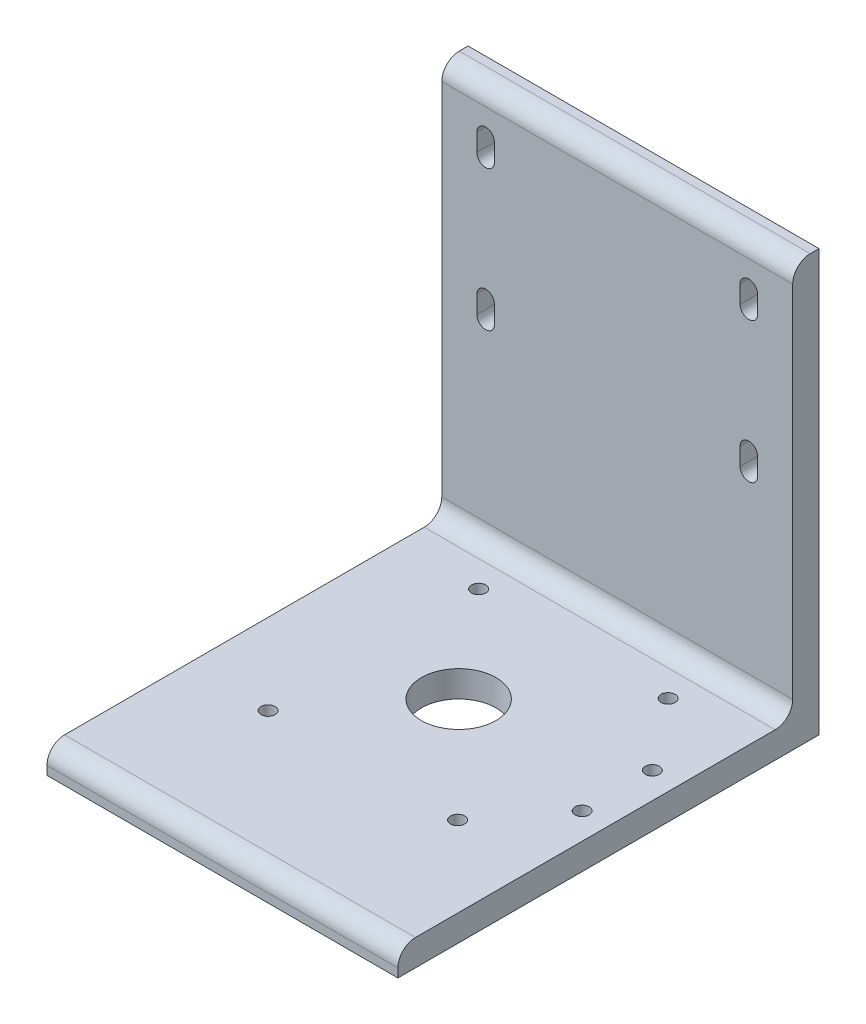
ISO-10303-21;
HEADER;
FILE_DESCRIPTION(('STEP AP214'),'2;1');
FILE_NAME('part.step','',(''),(''),'','','');
FILE_SCHEMA(('AUTOMOTIVE_DESIGN { 1 0 10303 214 1 1 1 1 }'));
ENDSEC;
DATA;
#1=APPLICATION_CONTEXT('core data for automotive mechanical design processes');
#2=APPLICATION_PROTOCOL_DEFINITION('international standard','automotive_design',2000,#1);
#3=PRODUCT_CONTEXT('',#1,'mechanical');
#4=PRODUCT('Part','Part','',(#3));
#5=PRODUCT_RELATED_PRODUCT_CATEGORY('part','',(#4));
#6=PRODUCT_DEFINITION_FORMATION('','',#4);
#7=PRODUCT_DEFINITION_CONTEXT('part definition',#1,'design');
#8=PRODUCT_DEFINITION('design','',#6,#7);
#9=PRODUCT_DEFINITION_SHAPE('','',#8);
#10=(LENGTH_UNIT() NAMED_UNIT(*) SI_UNIT(.MILLI.,.METRE.));
#11=(NAMED_UNIT(*) PLANE_ANGLE_UNIT() SI_UNIT($,.RADIAN.));
#12=(NAMED_UNIT(*) SI_UNIT($,.STERADIAN.) SOLID_ANGLE_UNIT());
#13=UNCERTAINTY_MEASURE_WITH_UNIT(LENGTH_MEASURE(1.E-05),#10,'distance_accuracy_value','');
#14=(GEOMETRIC_REPRESENTATION_CONTEXT(3) GLOBAL_UNCERTAINTY_ASSIGNED_CONTEXT((#13)) GLOBAL_UNIT_ASSIGNED_CONTEXT((#10,
#11,#12)) REPRESENTATION_CONTEXT('',''));
#15=CARTESIAN_POINT('',(0.,0.,0.));
#16=DIRECTION('',(0.,0.,1.));
#17=DIRECTION('',(1.,0.,0.));
#18=AXIS2_PLACEMENT_3D('',#15,#16,#17);
#19=CARTESIAN_POINT('',(63.5,0.,152.4));
#20=DIRECTION('',(0.,1.,0.));
#21=DIRECTION('',(0.,0.,1.));
#22=AXIS2_PLACEMENT_3D('',#19,#20,#21);
#23=PLANE('',#22);
#24=CARTESIAN_POINT('',(53.975,0.,50.8));
#25=DIRECTION('',(0.,-1.,0.));
#26=DIRECTION('',(0.,0.,-1.));
#27=AXIS2_PLACEMENT_3D('',#24,#25,#26);
#28=CIRCLE('',#27,2.55269999999999);
#29=CARTESIAN_POINT('',(53.975,0.,48.2473));
#30=VERTEX_POINT('',#29);
#31=EDGE_CURVE('E328',#30,#30,#28,.T.);
#32=ORIENTED_EDGE('',*,*,#31,.F.);
#33=EDGE_LOOP('',(#32));
#34=FACE_BOUND('',#33,.T.);
#35=CARTESIAN_POINT('',(53.975,0.,76.2));
#36=DIRECTION('',(0.,-1.,0.));
#37=DIRECTION('',(0.,0.,-1.));
#38=AXIS2_PLACEMENT_3D('',#35,#36,#37);
#39=CIRCLE('',#38,2.55269999999999);
#40=CARTESIAN_POINT('',(53.975,0.,73.6473));
#41=VERTEX_POINT('',#40);
#42=EDGE_CURVE('E332',#41,#41,#39,.T.);
#43=ORIENTED_EDGE('',*,*,#42,.F.);
#44=EDGE_LOOP('',(#43));
#45=FACE_BOUND('',#44,.T.);
#46=CARTESIAN_POINT('',(-3.4036,0.,63.5));
#47=DIRECTION('',(0.,1.,0.));
#48=DIRECTION('',(0.,0.,1.));
#49=AXIS2_PLACEMENT_3D('',#46,#47,#48);
#50=CIRCLE('',#49,13.49375);
#51=CARTESIAN_POINT('',(-3.4036,0.,76.99375));
#52=VERTEX_POINT('',#51);
#53=EDGE_CURVE('E341',#52,#52,#50,.T.);
#54=ORIENTED_EDGE('',*,*,#53,.T.);
#55=EDGE_LOOP('',(#54));
#56=FACE_BOUND('',#55,.T.);
#57=CARTESIAN_POINT('',(-34.29,0.,25.4));
#58=DIRECTION('',(0.,1.,0.));
#59=DIRECTION('',(0.,0.,1.));
#60=AXIS2_PLACEMENT_3D('',#57,#58,#59);
#61=CIRCLE('',#60,2.55269999999999);
#62=CARTESIAN_POINT('',(-34.29,0.,27.9527));
#63=VERTEX_POINT('',#62);
#64=EDGE_CURVE('E349',#63,#63,#61,.T.);
#65=ORIENTED_EDGE('',*,*,#64,.T.);
#66=EDGE_LOOP('',(#65));
#67=FACE_BOUND('',#66,.T.);
#68=CARTESIAN_POINT('',(34.29,0.,101.6));
#69=DIRECTION('',(0.,1.,0.));
#70=DIRECTION('',(0.,0.,1.));
#71=AXIS2_PLACEMENT_3D('',#68,#69,#70);
#72=CIRCLE('',#71,2.55269999999999);
#73=CARTESIAN_POINT('',(34.29,0.,104.1527));
#74=VERTEX_POINT('',#73);
#75=EDGE_CURVE('E355',#74,#74,#72,.T.);
#76=ORIENTED_EDGE('',*,*,#75,.T.);
#77=EDGE_LOOP('',(#76));
#78=FACE_BOUND('',#77,.T.);
#79=CARTESIAN_POINT('',(-34.29,0.,101.6));
#80=DIRECTION('',(0.,1.,0.));
#81=DIRECTION('',(0.,0.,1.));
#82=AXIS2_PLACEMENT_3D('',#79,#80,#81);
#83=CIRCLE('',#82,2.55269999999999);
#84=CARTESIAN_POINT('',(-34.29,0.,104.1527));
#85=VERTEX_POINT('',#84);
#86=EDGE_CURVE('E361',#85,#85,#83,.T.);
#87=ORIENTED_EDGE('',*,*,#86,.T.);
#88=EDGE_LOOP('',(#87));
#89=FACE_BOUND('',#88,.T.);
#90=CARTESIAN_POINT('',(34.29,0.,25.4));
#91=DIRECTION('',(0.,1.,0.));
#92=DIRECTION('',(0.,0.,1.));
#93=AXIS2_PLACEMENT_3D('',#90,#91,#92);
#94=CIRCLE('',#93,2.55269999999999);
#95=CARTESIAN_POINT('',(34.29,0.,27.9527));
#96=VERTEX_POINT('',#95);
#97=EDGE_CURVE('E367',#96,#96,#94,.T.);
#98=ORIENTED_EDGE('',*,*,#97,.T.);
#99=EDGE_LOOP('',(#98));
#100=FACE_BOUND('',#99,.T.);
#101=DIRECTION('',(0.,0.,-1.));
#102=VECTOR('',#101,1.);
#103=CARTESIAN_POINT('',(-63.5,0.,152.4));
#104=LINE('',#103,#102);
#105=CARTESIAN_POINT('',(-63.5,0.,152.4));
#106=VERTEX_POINT('',#105);
#107=CARTESIAN_POINT('',(-63.5,0.,0.));
#108=VERTEX_POINT('',#107);
#109=EDGE_CURVE('E370',#106,#108,#104,.T.);
#110=ORIENTED_EDGE('',*,*,#109,.T.);
#111=DIRECTION('',(-1.,0.,0.));
#112=VECTOR('',#111,1.);
#113=CARTESIAN_POINT('',(63.5,0.,0.));
#114=LINE('',#113,#112);
#115=CARTESIAN_POINT('',(63.5,0.,0.));
#116=VERTEX_POINT('',#115);
#117=EDGE_CURVE('E408',#116,#108,#114,.T.);
#118=ORIENTED_EDGE('',*,*,#117,.F.);
#119=DIRECTION('',(0.,0.,-1.));
#120=VECTOR('',#119,1.);
#121=CARTESIAN_POINT('',(63.5,0.,152.4));
#122=LINE('',#121,#120);
#123=CARTESIAN_POINT('',(63.5,0.,152.4));
#124=VERTEX_POINT('',#123);
#125=EDGE_CURVE('E371',#124,#116,#122,.T.);
#126=ORIENTED_EDGE('',*,*,#125,.F.);
#127=DIRECTION('',(-1.,0.,0.));
#128=VECTOR('',#127,1.);
#129=CARTESIAN_POINT('',(63.5,0.,152.4));
#130=LINE('',#129,#128);
#131=EDGE_CURVE('E388',#124,#106,#130,.T.);
#132=ORIENTED_EDGE('',*,*,#131,.T.);
#133=EDGE_LOOP('',(#110,#118,#126,#132));
#134=FACE_BOUND('',#133,.T.);
#135=ADVANCED_FACE('F33',(#34,#45,#56,#67,#78,#89,#100,#134),#23,.F.);
#136=CARTESIAN_POINT('',(63.5,0.,0.));
#137=DIRECTION('',(0.,0.,1.));
#138=DIRECTION('',(1.,0.,0.));
#139=AXIS2_PLACEMENT_3D('',#136,#137,#138);
#140=PLANE('',#139);
#141=DIRECTION('',(0.,-1.,0.));
#142=VECTOR('',#141,1.);
#143=CARTESIAN_POINT('',(-44.45,136.525,0.));
#144=LINE('',#143,#142);
#145=CARTESIAN_POINT('',(-44.45,136.525,0.));
#146=VERTEX_POINT('',#145);
#147=CARTESIAN_POINT('',(-44.45,130.175,0.));
#148=VERTEX_POINT('',#147);
#149=EDGE_CURVE('E221',#146,#148,#144,.T.);
#150=ORIENTED_EDGE('',*,*,#149,.F.);
#151=CARTESIAN_POINT('',(-47.625,136.525,0.));
#152=DIRECTION('',(0.,0.,-1.));
#153=DIRECTION('',(-1.,0.,0.));
#154=AXIS2_PLACEMENT_3D('',#151,#152,#153);
#155=CIRCLE('',#154,3.175);
#156=CARTESIAN_POINT('',(-50.8,136.525,0.));
#157=VERTEX_POINT('',#156);
#158=EDGE_CURVE('E48',#157,#146,#155,.T.);
#159=ORIENTED_EDGE('',*,*,#158,.F.);
#160=DIRECTION('',(0.,1.,0.));
#161=VECTOR('',#160,1.);
#162=CARTESIAN_POINT('',(-50.8,136.525,0.));
#163=LINE('',#162,#161);
#164=CARTESIAN_POINT('',(-50.8,130.175,0.));
#165=VERTEX_POINT('',#164);
#166=EDGE_CURVE('E207',#165,#157,#163,.T.);
#167=ORIENTED_EDGE('',*,*,#166,.F.);
#168=CARTESIAN_POINT('',(-47.625,130.175,0.));
#169=DIRECTION('',(0.,0.,-1.));
#170=DIRECTION('',(-1.,0.,0.));
#171=AXIS2_PLACEMENT_3D('',#168,#169,#170);
#172=CIRCLE('',#171,3.175);
#173=EDGE_CURVE('E227',#148,#165,#172,.T.);
#174=ORIENTED_EDGE('',*,*,#173,.F.);
#175=EDGE_LOOP('',(#150,#159,#167,#174));
#176=FACE_BOUND('',#175,.T.);
#177=DIRECTION('',(0.,-1.,0.));
#178=VECTOR('',#177,1.);
#179=CARTESIAN_POINT('',(-44.45,85.725,0.));
#180=LINE('',#179,#178);
#181=CARTESIAN_POINT('',(-44.45,85.725,0.));
#182=VERTEX_POINT('',#181);
#183=CARTESIAN_POINT('',(-44.45,79.375,0.));
#184=VERTEX_POINT('',#183);
#185=EDGE_CURVE('E245',#182,#184,#180,.T.);
#186=ORIENTED_EDGE('',*,*,#185,.F.);
#187=CARTESIAN_POINT('',(-47.625,85.725,0.));
#188=DIRECTION('',(0.,0.,-1.));
#189=DIRECTION('',(-1.,0.,0.));
#190=AXIS2_PLACEMENT_3D('',#187,#188,#189);
#191=CIRCLE('',#190,3.175);
#192=CARTESIAN_POINT('',(-50.8,85.725,0.));
#193=VERTEX_POINT('',#192);
#194=EDGE_CURVE('E243',#193,#182,#191,.T.);
#195=ORIENTED_EDGE('',*,*,#194,.F.);
#196=DIRECTION('',(0.,1.,0.));
#197=VECTOR('',#196,1.);
#198=CARTESIAN_POINT('',(-50.8,85.725,0.));
#199=LINE('',#198,#197);
#200=CARTESIAN_POINT('',(-50.8,79.375,0.));
#201=VERTEX_POINT('',#200);
#202=EDGE_CURVE('E251',#201,#193,#199,.T.);
#203=ORIENTED_EDGE('',*,*,#202,.F.);
#204=CARTESIAN_POINT('',(-47.625,79.375,0.));
#205=DIRECTION('',(0.,0.,-1.));
#206=DIRECTION('',(-1.,0.,0.));
#207=AXIS2_PLACEMENT_3D('',#204,#205,#206);
#208=CIRCLE('',#207,3.175);
#209=EDGE_CURVE('E248',#184,#201,#208,.T.);
#210=ORIENTED_EDGE('',*,*,#209,.F.);
#211=EDGE_LOOP('',(#186,#195,#203,#210));
#212=FACE_BOUND('',#211,.T.);
#213=DIRECTION('',(0.,-1.,0.));
#214=VECTOR('',#213,1.);
#215=CARTESIAN_POINT('',(50.8,85.725,0.));
#216=LINE('',#215,#214);
#217=CARTESIAN_POINT('',(50.8,85.725,0.));
#218=VERTEX_POINT('',#217);
#219=CARTESIAN_POINT('',(50.8,79.375,0.));
#220=VERTEX_POINT('',#219);
#221=EDGE_CURVE('E276',#218,#220,#216,.T.);
#222=ORIENTED_EDGE('',*,*,#221,.F.);
#223=CARTESIAN_POINT('',(47.625,85.725,0.));
#224=DIRECTION('',(0.,0.,-1.));
#225=DIRECTION('',(-1.,0.,0.));
#226=AXIS2_PLACEMENT_3D('',#223,#224,#225);
#227=CIRCLE('',#226,3.175);
#228=CARTESIAN_POINT('',(44.45,85.725,0.));
#229=VERTEX_POINT('',#228);
#230=EDGE_CURVE('E274',#229,#218,#227,.T.);
#231=ORIENTED_EDGE('',*,*,#230,.F.);
#232=DIRECTION('',(0.,1.,0.));
#233=VECTOR('',#232,1.);
#234=CARTESIAN_POINT('',(44.45,85.725,0.));
#235=LINE('',#234,#233);
#236=CARTESIAN_POINT('',(44.45,79.375,0.));
#237=VERTEX_POINT('',#236);
#238=EDGE_CURVE('E282',#237,#229,#235,.T.);
#239=ORIENTED_EDGE('',*,*,#238,.F.);
#240=CARTESIAN_POINT('',(47.625,79.375,0.));
#241=DIRECTION('',(0.,0.,-1.));
#242=DIRECTION('',(-1.,0.,0.));
#243=AXIS2_PLACEMENT_3D('',#240,#241,#242);
#244=CIRCLE('',#243,3.175);
#245=EDGE_CURVE('E279',#220,#237,#244,.T.);
#246=ORIENTED_EDGE('',*,*,#245,.F.);
#247=EDGE_LOOP('',(#222,#231,#239,#246));
#248=FACE_BOUND('',#247,.T.);
#249=DIRECTION('',(0.,-1.,0.));
#250=VECTOR('',#249,1.);
#251=CARTESIAN_POINT('',(50.8,136.525,0.));
#252=LINE('',#251,#250);
#253=CARTESIAN_POINT('',(50.8,136.525,0.));
#254=VERTEX_POINT('',#253);
#255=CARTESIAN_POINT('',(50.8,130.175,0.));
#256=VERTEX_POINT('',#255);
#257=EDGE_CURVE('E307',#254,#256,#252,.T.);
#258=ORIENTED_EDGE('',*,*,#257,.F.);
#259=CARTESIAN_POINT('',(47.625,136.525,0.));
#260=DIRECTION('',(0.,0.,-1.));
#261=DIRECTION('',(-1.,0.,0.));
#262=AXIS2_PLACEMENT_3D('',#259,#260,#261);
#263=CIRCLE('',#262,3.175);
#264=CARTESIAN_POINT('',(44.45,136.525,0.));
#265=VERTEX_POINT('',#264);
#266=EDGE_CURVE('E305',#265,#254,#263,.T.);
#267=ORIENTED_EDGE('',*,*,#266,.F.);
#268=DIRECTION('',(0.,1.,0.));
#269=VECTOR('',#268,1.);
#270=CARTESIAN_POINT('',(44.45,136.525,0.));
#271=LINE('',#270,#269);
#272=CARTESIAN_POINT('',(44.45,130.175,0.));
#273=VERTEX_POINT('',#272);
#274=EDGE_CURVE('E313',#273,#265,#271,.T.);
#275=ORIENTED_EDGE('',*,*,#274,.F.);
#276=CARTESIAN_POINT('',(47.625,130.175,0.));
#277=DIRECTION('',(0.,0.,-1.));
#278=DIRECTION('',(-1.,0.,0.));
#279=AXIS2_PLACEMENT_3D('',#276,#277,#278);
#280=CIRCLE('',#279,3.175);
#281=EDGE_CURVE('E310',#256,#273,#280,.T.);
#282=ORIENTED_EDGE('',*,*,#281,.F.);
#283=EDGE_LOOP('',(#258,#267,#275,#282));
#284=FACE_BOUND('',#283,.T.);
#285=DIRECTION('',(0.,1.,0.));
#286=VECTOR('',#285,1.);
#287=CARTESIAN_POINT('',(-63.5,0.,0.));
#288=LINE('',#287,#286);
#289=CARTESIAN_POINT('',(-63.5,152.4,0.));
#290=VERTEX_POINT('',#289);
#291=EDGE_CURVE('E391',#108,#290,#288,.T.);
#292=ORIENTED_EDGE('',*,*,#291,.T.);
#293=DIRECTION('',(-1.,0.,0.));
#294=VECTOR('',#293,1.);
#295=CARTESIAN_POINT('',(63.5,152.4,0.));
#296=LINE('',#295,#294);
#297=CARTESIAN_POINT('',(63.5,152.4,0.));
#298=VERTEX_POINT('',#297);
#299=EDGE_CURVE('E405',#298,#290,#296,.T.);
#300=ORIENTED_EDGE('',*,*,#299,.F.);
#301=DIRECTION('',(0.,1.,0.));
#302=VECTOR('',#301,1.);
#303=CARTESIAN_POINT('',(63.5,0.,0.));
#304=LINE('',#303,#302);
#305=EDGE_CURVE('E374',#116,#298,#304,.T.);
#306=ORIENTED_EDGE('',*,*,#305,.F.);
#307=ORIENTED_EDGE('',*,*,#117,.T.);
#308=EDGE_LOOP('',(#292,#300,#306,#307));
#309=FACE_BOUND('',#308,.T.);
#310=ADVANCED_FACE('F468',(#176,#212,#248,#284,#309),#140,.F.);
#311=CARTESIAN_POINT('',(63.5,152.4,0.));
#312=DIRECTION('',(0.,-1.,0.));
#313=DIRECTION('',(0.,0.,-1.));
#314=AXIS2_PLACEMENT_3D('',#311,#312,#313);
#315=PLANE('',#314);
#316=DIRECTION('',(0.,0.,1.));
#317=VECTOR('',#316,1.);
#318=CARTESIAN_POINT('',(-63.5,152.4,0.));
#319=LINE('',#318,#317);
#320=CARTESIAN_POINT('',(-63.5,152.4,3.175));
#321=VERTEX_POINT('',#320);
#322=EDGE_CURVE('E393',#290,#321,#319,.T.);
#323=ORIENTED_EDGE('',*,*,#322,.T.);
#324=DIRECTION('',(-1.,0.,0.));
#325=VECTOR('',#324,1.);
#326=CARTESIAN_POINT('',(63.5,152.4,3.175));
#327=LINE('',#326,#325);
#328=CARTESIAN_POINT('',(63.5,152.4,3.175));
#329=VERTEX_POINT('',#328);
#330=EDGE_CURVE('E432',#321,#329,#327,.F.);
#331=ORIENTED_EDGE('',*,*,#330,.T.);
#332=DIRECTION('',(0.,0.,1.));
#333=VECTOR('',#332,1.);
#334=CARTESIAN_POINT('',(63.5,152.4,0.));
#335=LINE('',#334,#333);
#336=EDGE_CURVE('E377',#298,#329,#335,.T.);
#337=ORIENTED_EDGE('',*,*,#336,.F.);
#338=ORIENTED_EDGE('',*,*,#299,.T.);
#339=EDGE_LOOP('',(#323,#331,#337,#338));
#340=FACE_BOUND('',#339,.T.);
#341=ADVANCED_FACE('F471',(#340),#315,.F.);
#342=CARTESIAN_POINT('',(63.5,152.4,9.525));
#343=DIRECTION('',(0.,0.,-1.));
#344=DIRECTION('',(0.,1.,0.));
#345=AXIS2_PLACEMENT_3D('',#342,#343,#344);
#346=PLANE('',#345);
#347=DIRECTION('',(0.,-1.,0.));
#348=VECTOR('',#347,1.);
#349=CARTESIAN_POINT('',(-50.8,136.525,9.52500000000001));
#350=LINE('',#349,#348);
#351=CARTESIAN_POINT('',(-50.8,136.525,9.52500000000001));
#352=VERTEX_POINT('',#351);
#353=CARTESIAN_POINT('',(-50.8,130.175,9.52500000000001));
#354=VERTEX_POINT('',#353);
#355=EDGE_CURVE('E219',#352,#354,#350,.T.);
#356=ORIENTED_EDGE('',*,*,#355,.F.);
#357=CARTESIAN_POINT('',(-47.625,136.525,9.52500000000001));
#358=DIRECTION('',(0.,0.,-1.));
#359=DIRECTION('',(0.,1.,0.));
#360=AXIS2_PLACEMENT_3D('',#357,#358,#359);
#361=CIRCLE('',#360,3.175);
#362=CARTESIAN_POINT('',(-44.45,136.525,9.52500000000001));
#363=VERTEX_POINT('',#362);
#364=EDGE_CURVE('E201',#363,#352,#361,.F.);
#365=ORIENTED_EDGE('',*,*,#364,.F.);
#366=DIRECTION('',(0.,1.,0.));
#367=VECTOR('',#366,1.);
#368=CARTESIAN_POINT('',(-44.45,136.525,9.52500000000001));
#369=LINE('',#368,#367);
#370=CARTESIAN_POINT('',(-44.45,130.175,9.525));
#371=VERTEX_POINT('',#370);
#372=EDGE_CURVE('E210',#371,#363,#369,.T.);
#373=ORIENTED_EDGE('',*,*,#372,.F.);
#374=CARTESIAN_POINT('',(-47.625,130.175,9.52500000000001));
#375=DIRECTION('',(0.,0.,-1.));
#376=DIRECTION('',(0.,1.,0.));
#377=AXIS2_PLACEMENT_3D('',#374,#375,#376);
#378=CIRCLE('',#377,3.175);
#379=EDGE_CURVE('E56',#354,#371,#378,.F.);
#380=ORIENTED_EDGE('',*,*,#379,.F.);
#381=EDGE_LOOP('',(#356,#365,#373,#380));
#382=FACE_BOUND('',#381,.T.);
#383=DIRECTION('',(0.,-1.,0.));
#384=VECTOR('',#383,1.);
#385=CARTESIAN_POINT('',(-50.8,85.725,9.52500000000001));
#386=LINE('',#385,#384);
#387=CARTESIAN_POINT('',(-50.8,85.725,9.52500000000001));
#388=VERTEX_POINT('',#387);
#389=CARTESIAN_POINT('',(-50.8,79.375,9.52500000000001));
#390=VERTEX_POINT('',#389);
#391=EDGE_CURVE('E237',#388,#390,#386,.T.);
#392=ORIENTED_EDGE('',*,*,#391,.F.);
#393=CARTESIAN_POINT('',(-47.625,85.725,9.52500000000001));
#394=DIRECTION('',(0.,0.,-1.));
#395=DIRECTION('',(0.,1.,0.));
#396=AXIS2_PLACEMENT_3D('',#393,#394,#395);
#397=CIRCLE('',#396,3.175);
#398=CARTESIAN_POINT('',(-44.45,85.725,9.52500000000001));
#399=VERTEX_POINT('',#398);
#400=EDGE_CURVE('E240',#399,#388,#397,.F.);
#401=ORIENTED_EDGE('',*,*,#400,.F.);
#402=DIRECTION('',(0.,1.,0.));
#403=VECTOR('',#402,1.);
#404=CARTESIAN_POINT('',(-44.45,85.725,9.52500000000001));
#405=LINE('',#404,#403);
#406=CARTESIAN_POINT('',(-44.45,79.375,9.525));
#407=VERTEX_POINT('',#406);
#408=EDGE_CURVE('E257',#407,#399,#405,.T.);
#409=ORIENTED_EDGE('',*,*,#408,.F.);
#410=CARTESIAN_POINT('',(-47.625,79.375,9.52500000000001));
#411=DIRECTION('',(0.,0.,-1.));
#412=DIRECTION('',(0.,1.,0.));
#413=AXIS2_PLACEMENT_3D('',#410,#411,#412);
#414=CIRCLE('',#413,3.175);
#415=EDGE_CURVE('E213',#390,#407,#414,.F.);
#416=ORIENTED_EDGE('',*,*,#415,.F.);
#417=EDGE_LOOP('',(#392,#401,#409,#416));
#418=FACE_BOUND('',#417,.T.);
#419=DIRECTION('',(0.,-1.,0.));
#420=VECTOR('',#419,1.);
#421=CARTESIAN_POINT('',(44.45,85.725,9.52500000000001));
#422=LINE('',#421,#420);
#423=CARTESIAN_POINT('',(44.45,85.725,9.52500000000001));
#424=VERTEX_POINT('',#423);
#425=CARTESIAN_POINT('',(44.45,79.375,9.52500000000001));
#426=VERTEX_POINT('',#425);
#427=EDGE_CURVE('E268',#424,#426,#422,.T.);
#428=ORIENTED_EDGE('',*,*,#427,.F.);
#429=CARTESIAN_POINT('',(47.625,85.725,9.52500000000001));
#430=DIRECTION('',(0.,0.,-1.));
#431=DIRECTION('',(0.,1.,0.));
#432=AXIS2_PLACEMENT_3D('',#429,#430,#431);
#433=CIRCLE('',#432,3.175);
#434=CARTESIAN_POINT('',(50.8,85.725,9.52500000000001));
#435=VERTEX_POINT('',#434);
#436=EDGE_CURVE('E271',#435,#424,#433,.F.);
#437=ORIENTED_EDGE('',*,*,#436,.F.);
#438=DIRECTION('',(0.,1.,0.));
#439=VECTOR('',#438,1.);
#440=CARTESIAN_POINT('',(50.8,85.725,9.52500000000001));
#441=LINE('',#440,#439);
#442=CARTESIAN_POINT('',(50.8,79.375,9.525));
#443=VERTEX_POINT('',#442);
#444=EDGE_CURVE('E288',#443,#435,#441,.T.);
#445=ORIENTED_EDGE('',*,*,#444,.F.);
#446=CARTESIAN_POINT('',(47.625,79.375,9.52500000000001));
#447=DIRECTION('',(0.,0.,-1.));
#448=DIRECTION('',(0.,1.,0.));
#449=AXIS2_PLACEMENT_3D('',#446,#447,#448);
#450=CIRCLE('',#449,3.175);
#451=EDGE_CURVE('E266',#426,#443,#450,.F.);
#452=ORIENTED_EDGE('',*,*,#451,.F.);
#453=EDGE_LOOP('',(#428,#437,#445,#452));
#454=FACE_BOUND('',#453,.T.);
#455=DIRECTION('',(0.,-1.,0.));
#456=VECTOR('',#455,1.);
#457=CARTESIAN_POINT('',(44.45,136.525,9.52500000000001));
#458=LINE('',#457,#456);
#459=CARTESIAN_POINT('',(44.45,136.525,9.52500000000001));
#460=VERTEX_POINT('',#459);
#461=CARTESIAN_POINT('',(44.45,130.175,9.52500000000001));
#462=VERTEX_POINT('',#461);
#463=EDGE_CURVE('E299',#460,#462,#458,.T.);
#464=ORIENTED_EDGE('',*,*,#463,.F.);
#465=CARTESIAN_POINT('',(47.625,136.525,9.52500000000001));
#466=DIRECTION('',(0.,0.,-1.));
#467=DIRECTION('',(0.,1.,0.));
#468=AXIS2_PLACEMENT_3D('',#465,#466,#467);
#469=CIRCLE('',#468,3.175);
#470=CARTESIAN_POINT('',(50.8,136.525,9.52500000000001));
#471=VERTEX_POINT('',#470);
#472=EDGE_CURVE('E302',#471,#460,#469,.F.);
#473=ORIENTED_EDGE('',*,*,#472,.F.);
#474=DIRECTION('',(0.,1.,0.));
#475=VECTOR('',#474,1.);
#476=CARTESIAN_POINT('',(50.8,136.525,9.52500000000001));
#477=LINE('',#476,#475);
#478=CARTESIAN_POINT('',(50.8,130.175,9.525));
#479=VERTEX_POINT('',#478);
#480=EDGE_CURVE('E319',#479,#471,#477,.T.);
#481=ORIENTED_EDGE('',*,*,#480,.F.);
#482=CARTESIAN_POINT('',(47.625,130.175,9.52500000000001));
#483=DIRECTION('',(0.,0.,-1.));
#484=DIRECTION('',(0.,1.,0.));
#485=AXIS2_PLACEMENT_3D('',#482,#483,#484);
#486=CIRCLE('',#485,3.175);
#487=EDGE_CURVE('E297',#462,#479,#486,.F.);
#488=ORIENTED_EDGE('',*,*,#487,.F.);
#489=EDGE_LOOP('',(#464,#473,#481,#488));
#490=FACE_BOUND('',#489,.T.);
#491=DIRECTION('',(0.,-1.,0.));
#492=VECTOR('',#491,1.);
#493=CARTESIAN_POINT('',(-63.5,152.4,9.525));
#494=LINE('',#493,#492);
#495=CARTESIAN_POINT('',(-63.5,146.05,9.525));
#496=VERTEX_POINT('',#495);
#497=CARTESIAN_POINT('',(-63.5,15.875,9.52499999999999));
#498=VERTEX_POINT('',#497);
#499=EDGE_CURVE('E396',#496,#498,#494,.T.);
#500=ORIENTED_EDGE('',*,*,#499,.T.);
#501=DIRECTION('',(-1.,0.,0.));
#502=VECTOR('',#501,1.);
#503=CARTESIAN_POINT('',(63.5,15.875,9.52499999999999));
#504=LINE('',#503,#502);
#505=CARTESIAN_POINT('',(63.5,15.875,9.52499999999999));
#506=VERTEX_POINT('',#505);
#507=EDGE_CURVE('E419',#498,#506,#504,.F.);
#508=ORIENTED_EDGE('',*,*,#507,.T.);
#509=DIRECTION('',(0.,-1.,0.));
#510=VECTOR('',#509,1.);
#511=CARTESIAN_POINT('',(63.5,152.4,9.525));
#512=LINE('',#511,#510);
#513=CARTESIAN_POINT('',(63.5,146.05,9.525));
#514=VERTEX_POINT('',#513);
#515=EDGE_CURVE('E380',#514,#506,#512,.T.);
#516=ORIENTED_EDGE('',*,*,#515,.F.);
#517=DIRECTION('',(-1.,0.,0.));
#518=VECTOR('',#517,1.);
#519=CARTESIAN_POINT('',(63.5,146.05,9.525));
#520=LINE('',#519,#518);
#521=EDGE_CURVE('E416',#514,#496,#520,.T.);
#522=ORIENTED_EDGE('',*,*,#521,.T.);
#523=EDGE_LOOP('',(#500,#508,#516,#522));
#524=FACE_BOUND('',#523,.T.);
#525=ADVANCED_FACE('F216',(#382,#418,#454,#490,#524),#346,.F.);
#526=CARTESIAN_POINT('',(63.5,9.52500000000001,9.52499999999999));
#527=DIRECTION('',(0.,-1.,0.));
#528=DIRECTION('',(0.,0.,-1.));
#529=AXIS2_PLACEMENT_3D('',#526,#527,#528);
#530=PLANE('',#529);
#531=CARTESIAN_POINT('',(53.975,9.525,50.8));
#532=DIRECTION('',(0.,-1.,0.));
#533=DIRECTION('',(0.,0.,-1.));
#534=AXIS2_PLACEMENT_3D('',#531,#532,#533);
#535=CIRCLE('',#534,2.55269999999999);
#536=CARTESIAN_POINT('',(53.975,9.525,48.2473));
#537=VERTEX_POINT('',#536);
#538=EDGE_CURVE('E329',#537,#537,#535,.F.);
#539=ORIENTED_EDGE('',*,*,#538,.F.);
#540=EDGE_LOOP('',(#539));
#541=FACE_BOUND('',#540,.T.);
#542=CARTESIAN_POINT('',(53.975,9.525,76.2));
#543=DIRECTION('',(0.,-1.,0.));
#544=DIRECTION('',(0.,0.,-1.));
#545=AXIS2_PLACEMENT_3D('',#542,#543,#544);
#546=CIRCLE('',#545,2.55269999999999);
#547=CARTESIAN_POINT('',(53.975,9.525,73.6473));
#548=VERTEX_POINT('',#547);
#549=EDGE_CURVE('E335',#548,#548,#546,.F.);
#550=ORIENTED_EDGE('',*,*,#549,.F.);
#551=EDGE_LOOP('',(#550));
#552=FACE_BOUND('',#551,.T.);
#553=CARTESIAN_POINT('',(-3.4036,9.525,63.5));
#554=DIRECTION('',(0.,1.,0.));
#555=DIRECTION('',(0.,0.,1.));
#556=AXIS2_PLACEMENT_3D('',#553,#554,#555);
#557=CIRCLE('',#556,13.49375);
#558=CARTESIAN_POINT('',(-3.4036,9.525,76.99375));
#559=VERTEX_POINT('',#558);
#560=EDGE_CURVE('E338',#559,#559,#557,.T.);
#561=ORIENTED_EDGE('',*,*,#560,.F.);
#562=EDGE_LOOP('',(#561));
#563=FACE_BOUND('',#562,.T.);
#564=CARTESIAN_POINT('',(-34.29,9.52500000000001,25.4));
#565=DIRECTION('',(0.,1.,0.));
#566=DIRECTION('',(0.,0.,1.));
#567=AXIS2_PLACEMENT_3D('',#564,#565,#566);
#568=CIRCLE('',#567,2.55269999999999);
#569=CARTESIAN_POINT('',(-34.29,9.52500000000001,27.9527));
#570=VERTEX_POINT('',#569);
#571=EDGE_CURVE('E344',#570,#570,#568,.T.);
#572=ORIENTED_EDGE('',*,*,#571,.F.);
#573=EDGE_LOOP('',(#572));
#574=FACE_BOUND('',#573,.T.);
#575=CARTESIAN_POINT('',(34.29,9.525,101.6));
#576=DIRECTION('',(0.,1.,0.));
#577=DIRECTION('',(0.,0.,1.));
#578=AXIS2_PLACEMENT_3D('',#575,#576,#577);
#579=CIRCLE('',#578,2.55269999999999);
#580=CARTESIAN_POINT('',(34.29,9.525,104.1527));
#581=VERTEX_POINT('',#580);
#582=EDGE_CURVE('E352',#581,#581,#579,.T.);
#583=ORIENTED_EDGE('',*,*,#582,.F.);
#584=EDGE_LOOP('',(#583));
#585=FACE_BOUND('',#584,.T.);
#586=CARTESIAN_POINT('',(-34.29,9.525,101.6));
#587=DIRECTION('',(0.,1.,0.));
#588=DIRECTION('',(0.,0.,1.));
#589=AXIS2_PLACEMENT_3D('',#586,#587,#588);
#590=CIRCLE('',#589,2.55269999999999);
#591=CARTESIAN_POINT('',(-34.29,9.525,104.1527));
#592=VERTEX_POINT('',#591);
#593=EDGE_CURVE('E358',#592,#592,#590,.T.);
#594=ORIENTED_EDGE('',*,*,#593,.F.);
#595=EDGE_LOOP('',(#594));
#596=FACE_BOUND('',#595,.T.);
#597=CARTESIAN_POINT('',(34.29,9.52500000000001,25.4));
#598=DIRECTION('',(0.,1.,0.));
#599=DIRECTION('',(0.,0.,1.));
#600=AXIS2_PLACEMENT_3D('',#597,#598,#599);
#601=CIRCLE('',#600,2.55269999999999);
#602=CARTESIAN_POINT('',(34.29,9.52500000000001,27.9527));
#603=VERTEX_POINT('',#602);
#604=EDGE_CURVE('E364',#603,#603,#601,.T.);
#605=ORIENTED_EDGE('',*,*,#604,.F.);
#606=EDGE_LOOP('',(#605));
#607=FACE_BOUND('',#606,.T.);
#608=DIRECTION('',(0.,0.,1.));
#609=VECTOR('',#608,1.);
#610=CARTESIAN_POINT('',(63.5,9.52500000000001,9.52499999999999));
#611=LINE('',#610,#609);
#612=CARTESIAN_POINT('',(63.5,9.52500000000001,15.875));
#613=VERTEX_POINT('',#612);
#614=CARTESIAN_POINT('',(63.5,9.525,146.05));
#615=VERTEX_POINT('',#614);
#616=EDGE_CURVE('E383',#613,#615,#611,.T.);
#617=ORIENTED_EDGE('',*,*,#616,.F.);
#618=DIRECTION('',(-1.,0.,0.));
#619=VECTOR('',#618,1.);
#620=CARTESIAN_POINT('',(-63.5,9.52500000000001,15.875));
#621=LINE('',#620,#619);
#622=CARTESIAN_POINT('',(-63.5,9.52500000000001,15.875));
#623=VERTEX_POINT('',#622);
#624=EDGE_CURVE('E413',#613,#623,#621,.T.);
#625=ORIENTED_EDGE('',*,*,#624,.T.);
#626=DIRECTION('',(0.,0.,1.));
#627=VECTOR('',#626,1.);
#628=CARTESIAN_POINT('',(-63.5,9.52500000000001,9.52499999999999));
#629=LINE('',#628,#627);
#630=CARTESIAN_POINT('',(-63.5,9.525,146.05));
#631=VERTEX_POINT('',#630);
#632=EDGE_CURVE('E399',#623,#631,#629,.T.);
#633=ORIENTED_EDGE('',*,*,#632,.T.);
#634=DIRECTION('',(-1.,0.,0.));
#635=VECTOR('',#634,1.);
#636=CARTESIAN_POINT('',(63.5,9.525,146.05));
#637=LINE('',#636,#635);
#638=EDGE_CURVE('E411',#631,#615,#637,.F.);
#639=ORIENTED_EDGE('',*,*,#638,.T.);
#640=EDGE_LOOP('',(#617,#625,#633,#639));
#641=FACE_BOUND('',#640,.T.);
#642=ADVANCED_FACE('F451',(#541,#552,#563,#574,#585,#596,#607,#641),#530,.F.);
#643=CARTESIAN_POINT('',(63.5,9.525,152.4));
#644=DIRECTION('',(0.,0.,-1.));
#645=DIRECTION('',(-1.,0.,0.));
#646=AXIS2_PLACEMENT_3D('',#643,#644,#645);
#647=PLANE('',#646);
#648=DIRECTION('',(0.,-1.,0.));
#649=VECTOR('',#648,1.);
#650=CARTESIAN_POINT('',(63.5,9.525,152.4));
#651=LINE('',#650,#649);
#652=CARTESIAN_POINT('',(63.5,3.175,152.4));
#653=VERTEX_POINT('',#652);
#654=EDGE_CURVE('E386',#653,#124,#651,.T.);
#655=ORIENTED_EDGE('',*,*,#654,.F.);
#656=DIRECTION('',(-1.,0.,0.));
#657=VECTOR('',#656,1.);
#658=CARTESIAN_POINT('',(63.5,3.175,152.4));
#659=LINE('',#658,#657);
#660=CARTESIAN_POINT('',(-63.5,3.175,152.4));
#661=VERTEX_POINT('',#660);
#662=EDGE_CURVE('E421',#653,#661,#659,.T.);
#663=ORIENTED_EDGE('',*,*,#662,.T.);
#664=DIRECTION('',(0.,-1.,0.));
#665=VECTOR('',#664,1.);
#666=CARTESIAN_POINT('',(-63.5,9.525,152.4));
#667=LINE('',#666,#665);
#668=EDGE_CURVE('E375',#661,#106,#667,.T.);
#669=ORIENTED_EDGE('',*,*,#668,.T.);
#670=ORIENTED_EDGE('',*,*,#131,.F.);
#671=EDGE_LOOP('',(#655,#663,#669,#670));
#672=FACE_BOUND('',#671,.T.);
#673=ADVANCED_FACE('F459',(#672),#647,.F.);
#674=CARTESIAN_POINT('',(63.5,0.,0.));
#675=DIRECTION('',(1.,0.,0.));
#676=DIRECTION('',(0.,0.,-1.));
#677=AXIS2_PLACEMENT_3D('',#674,#675,#676);
#678=PLANE('',#677);
#679=ORIENTED_EDGE('',*,*,#616,.T.);
#680=CARTESIAN_POINT('',(63.5,3.175,146.05));
#681=DIRECTION('',(1.,0.,0.));
#682=DIRECTION('',(0.,0.,-1.));
#683=AXIS2_PLACEMENT_3D('',#680,#681,#682);
#684=CIRCLE('',#683,6.35);
#685=EDGE_CURVE('E430',#615,#653,#684,.T.);
#686=ORIENTED_EDGE('',*,*,#685,.T.);
#687=ORIENTED_EDGE('',*,*,#654,.T.);
#688=ORIENTED_EDGE('',*,*,#125,.T.);
#689=ORIENTED_EDGE('',*,*,#305,.T.);
#690=ORIENTED_EDGE('',*,*,#336,.T.);
#691=CARTESIAN_POINT('',(63.5,146.05,3.175));
#692=DIRECTION('',(1.,0.,0.));
#693=DIRECTION('',(0.,0.,-1.));
#694=AXIS2_PLACEMENT_3D('',#691,#692,#693);
#695=CIRCLE('',#694,6.35);
#696=EDGE_CURVE('E428',#329,#514,#695,.T.);
#697=ORIENTED_EDGE('',*,*,#696,.T.);
#698=ORIENTED_EDGE('',*,*,#515,.T.);
#699=CARTESIAN_POINT('',(63.5,15.875,15.875));
#700=DIRECTION('',(1.,0.,0.));
#701=DIRECTION('',(0.,0.,-1.));
#702=AXIS2_PLACEMENT_3D('',#699,#700,#701);
#703=CIRCLE('',#702,6.35);
#704=EDGE_CURVE('E11',#506,#613,#703,.F.);
#705=ORIENTED_EDGE('',*,*,#704,.T.);
#706=EDGE_LOOP('',(#679,#686,#687,#688,#689,#690,#697,#698,#705));
#707=FACE_BOUND('',#706,.T.);
#708=ADVANCED_FACE('F448',(#707),#678,.T.);
#709=CARTESIAN_POINT('',(-63.5,0.,0.));
#710=DIRECTION('',(1.,0.,0.));
#711=DIRECTION('',(0.,0.,-1.));
#712=AXIS2_PLACEMENT_3D('',#709,#710,#711);
#713=PLANE('',#712);
#714=ORIENTED_EDGE('',*,*,#668,.F.);
#715=CARTESIAN_POINT('',(-63.5,3.175,146.05));
#716=DIRECTION('',(1.,0.,0.));
#717=DIRECTION('',(0.,0.,-1.));
#718=AXIS2_PLACEMENT_3D('',#715,#716,#717);
#719=CIRCLE('',#718,6.35);
#720=EDGE_CURVE('E426',#661,#631,#719,.F.);
#721=ORIENTED_EDGE('',*,*,#720,.T.);
#722=ORIENTED_EDGE('',*,*,#632,.F.);
#723=CARTESIAN_POINT('',(-63.5,15.875,15.875));
#724=DIRECTION('',(1.,0.,0.));
#725=DIRECTION('',(0.,0.,-1.));
#726=AXIS2_PLACEMENT_3D('',#723,#724,#725);
#727=CIRCLE('',#726,6.35);
#728=EDGE_CURVE('E41',#623,#498,#727,.T.);
#729=ORIENTED_EDGE('',*,*,#728,.T.);
#730=ORIENTED_EDGE('',*,*,#499,.F.);
#731=CARTESIAN_POINT('',(-63.5,146.05,3.175));
#732=DIRECTION('',(1.,0.,0.));
#733=DIRECTION('',(0.,0.,-1.));
#734=AXIS2_PLACEMENT_3D('',#731,#732,#733);
#735=CIRCLE('',#734,6.35);
#736=EDGE_CURVE('E424',#496,#321,#735,.F.);
#737=ORIENTED_EDGE('',*,*,#736,.T.);
#738=ORIENTED_EDGE('',*,*,#322,.F.);
#739=ORIENTED_EDGE('',*,*,#291,.F.);
#740=ORIENTED_EDGE('',*,*,#109,.F.);
#741=EDGE_LOOP('',(#714,#721,#722,#729,#730,#737,#738,#739,#740));
#742=FACE_BOUND('',#741,.T.);
#743=ADVANCED_FACE('F437',(#742),#713,.F.);
#744=CARTESIAN_POINT('',(63.5,15.875,15.875));
#745=DIRECTION('',(1.,0.,0.));
#746=DIRECTION('',(0.,0.,-1.));
#747=AXIS2_PLACEMENT_3D('',#744,#745,#746);
#748=CYLINDRICAL_SURFACE('',#747,6.35);
#749=ORIENTED_EDGE('',*,*,#704,.F.);
#750=ORIENTED_EDGE('',*,*,#507,.F.);
#751=ORIENTED_EDGE('',*,*,#728,.F.);
#752=ORIENTED_EDGE('',*,*,#624,.F.);
#753=EDGE_LOOP('',(#749,#750,#751,#752));
#754=FACE_BOUND('',#753,.T.);
#755=ADVANCED_FACE('F445',(#754),#748,.F.);
#756=CARTESIAN_POINT('',(63.5,3.175,146.05));
#757=DIRECTION('',(-1.,0.,0.));
#758=DIRECTION('',(0.,0.,1.));
#759=AXIS2_PLACEMENT_3D('',#756,#757,#758);
#760=CYLINDRICAL_SURFACE('',#759,6.35);
#761=ORIENTED_EDGE('',*,*,#685,.F.);
#762=ORIENTED_EDGE('',*,*,#638,.F.);
#763=ORIENTED_EDGE('',*,*,#720,.F.);
#764=ORIENTED_EDGE('',*,*,#662,.F.);
#765=EDGE_LOOP('',(#761,#762,#763,#764));
#766=FACE_BOUND('',#765,.T.);
#767=ADVANCED_FACE('F454',(#766),#760,.T.);
#768=CARTESIAN_POINT('',(63.5,146.05,3.175));
#769=DIRECTION('',(-1.,0.,0.));
#770=DIRECTION('',(0.,0.,1.));
#771=AXIS2_PLACEMENT_3D('',#768,#769,#770);
#772=CYLINDRICAL_SURFACE('',#771,6.35);
#773=ORIENTED_EDGE('',*,*,#696,.F.);
#774=ORIENTED_EDGE('',*,*,#330,.F.);
#775=ORIENTED_EDGE('',*,*,#736,.F.);
#776=ORIENTED_EDGE('',*,*,#521,.F.);
#777=EDGE_LOOP('',(#773,#774,#775,#776));
#778=FACE_BOUND('',#777,.T.);
#779=ADVANCED_FACE('F35',(#778),#772,.T.);
#780=CARTESIAN_POINT('',(34.29,9.525,25.4));
#781=DIRECTION('',(0.,1.,0.));
#782=DIRECTION('',(0.,0.,1.));
#783=AXIS2_PLACEMENT_3D('',#780,#781,#782);
#784=CYLINDRICAL_SURFACE('',#783,2.55269999999999);
#785=ORIENTED_EDGE('',*,*,#97,.F.);
#786=EDGE_LOOP('',(#785));
#787=FACE_BOUND('',#786,.T.);
#788=ORIENTED_EDGE('',*,*,#604,.T.);
#789=EDGE_LOOP('',(#788));
#790=FACE_BOUND('',#789,.T.);
#791=ADVANCED_FACE('F475',(#787,#790),#784,.F.);
#792=CARTESIAN_POINT('',(-34.29,9.525,101.6));
#793=DIRECTION('',(0.,1.,0.));
#794=DIRECTION('',(0.,0.,1.));
#795=AXIS2_PLACEMENT_3D('',#792,#793,#794);
#796=CYLINDRICAL_SURFACE('',#795,2.55269999999999);
#797=ORIENTED_EDGE('',*,*,#86,.F.);
#798=EDGE_LOOP('',(#797));
#799=FACE_BOUND('',#798,.T.);
#800=ORIENTED_EDGE('',*,*,#593,.T.);
#801=EDGE_LOOP('',(#800));
#802=FACE_BOUND('',#801,.T.);
#803=ADVANCED_FACE('F480',(#799,#802),#796,.F.);
#804=CARTESIAN_POINT('',(34.29,9.525,101.6));
#805=DIRECTION('',(0.,1.,0.));
#806=DIRECTION('',(0.,0.,1.));
#807=AXIS2_PLACEMENT_3D('',#804,#805,#806);
#808=CYLINDRICAL_SURFACE('',#807,2.55269999999999);
#809=ORIENTED_EDGE('',*,*,#75,.F.);
#810=EDGE_LOOP('',(#809));
#811=FACE_BOUND('',#810,.T.);
#812=ORIENTED_EDGE('',*,*,#582,.T.);
#813=EDGE_LOOP('',(#812));
#814=FACE_BOUND('',#813,.T.);
#815=ADVANCED_FACE('F567',(#811,#814),#808,.F.);
#816=CARTESIAN_POINT('',(-34.29,9.525,25.4));
#817=DIRECTION('',(0.,1.,0.));
#818=DIRECTION('',(0.,0.,1.));
#819=AXIS2_PLACEMENT_3D('',#816,#817,#818);
#820=CYLINDRICAL_SURFACE('',#819,2.55269999999999);
#821=ORIENTED_EDGE('',*,*,#64,.F.);
#822=EDGE_LOOP('',(#821));
#823=FACE_BOUND('',#822,.T.);
#824=ORIENTED_EDGE('',*,*,#571,.T.);
#825=EDGE_LOOP('',(#824));
#826=FACE_BOUND('',#825,.T.);
#827=ADVANCED_FACE('F577',(#823,#826),#820,.F.);
#828=CARTESIAN_POINT('',(-3.4036,0.,63.5));
#829=DIRECTION('',(0.,1.,0.));
#830=DIRECTION('',(0.,0.,1.));
#831=AXIS2_PLACEMENT_3D('',#828,#829,#830);
#832=CYLINDRICAL_SURFACE('',#831,13.49375);
#833=ORIENTED_EDGE('',*,*,#53,.F.);
#834=EDGE_LOOP('',(#833));
#835=FACE_BOUND('',#834,.T.);
#836=ORIENTED_EDGE('',*,*,#560,.T.);
#837=EDGE_LOOP('',(#836));
#838=FACE_BOUND('',#837,.T.);
#839=ADVANCED_FACE('F587',(#835,#838),#832,.F.);
#840=CARTESIAN_POINT('',(53.975,0.,76.2));
#841=DIRECTION('',(0.,-1.,0.));
#842=DIRECTION('',(0.,0.,-1.));
#843=AXIS2_PLACEMENT_3D('',#840,#841,#842);
#844=CYLINDRICAL_SURFACE('',#843,2.55269999999999);
#845=ORIENTED_EDGE('',*,*,#549,.T.);
#846=EDGE_LOOP('',(#845));
#847=FACE_BOUND('',#846,.T.);
#848=ORIENTED_EDGE('',*,*,#42,.T.);
#849=EDGE_LOOP('',(#848));
#850=FACE_BOUND('',#849,.T.);
#851=ADVANCED_FACE('F596',(#847,#850),#844,.F.);
#852=CARTESIAN_POINT('',(53.975,0.,50.8));
#853=DIRECTION('',(0.,-1.,0.));
#854=DIRECTION('',(0.,0.,-1.));
#855=AXIS2_PLACEMENT_3D('',#852,#853,#854);
#856=CYLINDRICAL_SURFACE('',#855,2.55269999999999);
#857=ORIENTED_EDGE('',*,*,#538,.T.);
#858=EDGE_LOOP('',(#857));
#859=FACE_BOUND('',#858,.T.);
#860=ORIENTED_EDGE('',*,*,#31,.T.);
#861=EDGE_LOOP('',(#860));
#862=FACE_BOUND('',#861,.T.);
#863=ADVANCED_FACE('F621',(#859,#862),#856,.F.);
#864=CARTESIAN_POINT('',(47.625,136.525,152.401));
#865=DIRECTION('',(0.,0.,-1.));
#866=DIRECTION('',(-1.,0.,0.));
#867=AXIS2_PLACEMENT_3D('',#864,#865,#866);
#868=CYLINDRICAL_SURFACE('',#867,3.175);
#869=ORIENTED_EDGE('',*,*,#472,.T.);
#870=DIRECTION('',(0.,0.,-1.));
#871=VECTOR('',#870,1.);
#872=CARTESIAN_POINT('',(44.45,136.525,152.401));
#873=LINE('',#872,#871);
#874=EDGE_CURVE('E317',#460,#265,#873,.T.);
#875=ORIENTED_EDGE('',*,*,#874,.T.);
#876=ORIENTED_EDGE('',*,*,#266,.T.);
#877=DIRECTION('',(0.,0.,-1.));
#878=VECTOR('',#877,1.);
#879=CARTESIAN_POINT('',(50.8,136.525,152.401));
#880=LINE('',#879,#878);
#881=EDGE_CURVE('E316',#471,#254,#880,.T.);
#882=ORIENTED_EDGE('',*,*,#881,.F.);
#883=EDGE_LOOP('',(#869,#875,#876,#882));
#884=FACE_BOUND('',#883,.T.);
#885=ADVANCED_FACE('F625',(#884),#868,.F.);
#886=CARTESIAN_POINT('',(44.45,136.525,152.401));
#887=DIRECTION('',(-1.,0.,0.));
#888=DIRECTION('',(0.,0.,1.));
#889=AXIS2_PLACEMENT_3D('',#886,#887,#888);
#890=PLANE('',#889);
#891=ORIENTED_EDGE('',*,*,#463,.T.);
#892=DIRECTION('',(0.,0.,-1.));
#893=VECTOR('',#892,1.);
#894=CARTESIAN_POINT('',(44.45,130.175,152.401));
#895=LINE('',#894,#893);
#896=EDGE_CURVE('E320',#462,#273,#895,.T.);
#897=ORIENTED_EDGE('',*,*,#896,.T.);
#898=ORIENTED_EDGE('',*,*,#274,.T.);
#899=ORIENTED_EDGE('',*,*,#874,.F.);
#900=EDGE_LOOP('',(#891,#897,#898,#899));
#901=FACE_BOUND('',#900,.T.);
#902=ADVANCED_FACE('F642',(#901),#890,.F.);
#903=CARTESIAN_POINT('',(47.625,130.175,152.401));
#904=DIRECTION('',(0.,0.,-1.));
#905=DIRECTION('',(-1.,0.,0.));
#906=AXIS2_PLACEMENT_3D('',#903,#904,#905);
#907=CYLINDRICAL_SURFACE('',#906,3.175);
#908=ORIENTED_EDGE('',*,*,#487,.T.);
#909=DIRECTION('',(0.,0.,-1.));
#910=VECTOR('',#909,1.);
#911=CARTESIAN_POINT('',(50.8,130.175,152.401));
#912=LINE('',#911,#910);
#913=EDGE_CURVE('E322',#479,#256,#912,.T.);
#914=ORIENTED_EDGE('',*,*,#913,.T.);
#915=ORIENTED_EDGE('',*,*,#281,.T.);
#916=ORIENTED_EDGE('',*,*,#896,.F.);
#917=EDGE_LOOP('',(#908,#914,#915,#916));
#918=FACE_BOUND('',#917,.T.);
#919=ADVANCED_FACE('F648',(#918),#907,.F.);
#920=CARTESIAN_POINT('',(50.8,136.525,152.401));
#921=DIRECTION('',(1.,0.,0.));
#922=DIRECTION('',(0.,0.,-1.));
#923=AXIS2_PLACEMENT_3D('',#920,#921,#922);
#924=PLANE('',#923);
#925=ORIENTED_EDGE('',*,*,#480,.T.);
#926=ORIENTED_EDGE('',*,*,#881,.T.);
#927=ORIENTED_EDGE('',*,*,#257,.T.);
#928=ORIENTED_EDGE('',*,*,#913,.F.);
#929=EDGE_LOOP('',(#925,#926,#927,#928));
#930=FACE_BOUND('',#929,.T.);
#931=ADVANCED_FACE('F644',(#930),#924,.F.);
#932=CARTESIAN_POINT('',(47.625,85.725,152.401));
#933=DIRECTION('',(0.,0.,-1.));
#934=DIRECTION('',(-1.,0.,0.));
#935=AXIS2_PLACEMENT_3D('',#932,#933,#934);
#936=CYLINDRICAL_SURFACE('',#935,3.175);
#937=ORIENTED_EDGE('',*,*,#436,.T.);
#938=DIRECTION('',(0.,0.,-1.));
#939=VECTOR('',#938,1.);
#940=CARTESIAN_POINT('',(44.45,85.725,152.401));
#941=LINE('',#940,#939);
#942=EDGE_CURVE('E286',#424,#229,#941,.T.);
#943=ORIENTED_EDGE('',*,*,#942,.T.);
#944=ORIENTED_EDGE('',*,*,#230,.T.);
#945=DIRECTION('',(0.,0.,-1.));
#946=VECTOR('',#945,1.);
#947=CARTESIAN_POINT('',(50.8,85.725,152.401));
#948=LINE('',#947,#946);
#949=EDGE_CURVE('E285',#435,#218,#948,.T.);
#950=ORIENTED_EDGE('',*,*,#949,.F.);
#951=EDGE_LOOP('',(#937,#943,#944,#950));
#952=FACE_BOUND('',#951,.T.);
#953=ADVANCED_FACE('F647',(#952),#936,.F.);
#954=CARTESIAN_POINT('',(44.45,85.725,152.401));
#955=DIRECTION('',(-1.,0.,0.));
#956=DIRECTION('',(0.,0.,1.));
#957=AXIS2_PLACEMENT_3D('',#954,#955,#956);
#958=PLANE('',#957);
#959=ORIENTED_EDGE('',*,*,#427,.T.);
#960=DIRECTION('',(0.,0.,-1.));
#961=VECTOR('',#960,1.);
#962=CARTESIAN_POINT('',(44.45,79.375,152.401));
#963=LINE('',#962,#961);
#964=EDGE_CURVE('E289',#426,#237,#963,.T.);
#965=ORIENTED_EDGE('',*,*,#964,.T.);
#966=ORIENTED_EDGE('',*,*,#238,.T.);
#967=ORIENTED_EDGE('',*,*,#942,.F.);
#968=EDGE_LOOP('',(#959,#965,#966,#967));
#969=FACE_BOUND('',#968,.T.);
#970=ADVANCED_FACE('F658',(#969),#958,.F.);
#971=CARTESIAN_POINT('',(47.625,79.375,152.401));
#972=DIRECTION('',(0.,0.,-1.));
#973=DIRECTION('',(-1.,0.,0.));
#974=AXIS2_PLACEMENT_3D('',#971,#972,#973);
#975=CYLINDRICAL_SURFACE('',#974,3.175);
#976=ORIENTED_EDGE('',*,*,#451,.T.);
#977=DIRECTION('',(0.,0.,-1.));
#978=VECTOR('',#977,1.);
#979=CARTESIAN_POINT('',(50.8,79.375,152.401));
#980=LINE('',#979,#978);
#981=EDGE_CURVE('E291',#443,#220,#980,.T.);
#982=ORIENTED_EDGE('',*,*,#981,.T.);
#983=ORIENTED_EDGE('',*,*,#245,.T.);
#984=ORIENTED_EDGE('',*,*,#964,.F.);
#985=EDGE_LOOP('',(#976,#982,#983,#984));
#986=FACE_BOUND('',#985,.T.);
#987=ADVANCED_FACE('F664',(#986),#975,.F.);
#988=CARTESIAN_POINT('',(50.8,85.725,152.401));
#989=DIRECTION('',(1.,0.,0.));
#990=DIRECTION('',(0.,0.,-1.));
#991=AXIS2_PLACEMENT_3D('',#988,#989,#990);
#992=PLANE('',#991);
#993=ORIENTED_EDGE('',*,*,#444,.T.);
#994=ORIENTED_EDGE('',*,*,#949,.T.);
#995=ORIENTED_EDGE('',*,*,#221,.T.);
#996=ORIENTED_EDGE('',*,*,#981,.F.);
#997=EDGE_LOOP('',(#993,#994,#995,#996));
#998=FACE_BOUND('',#997,.T.);
#999=ADVANCED_FACE('F660',(#998),#992,.F.);
#1000=CARTESIAN_POINT('',(-47.625,85.725,152.401));
#1001=DIRECTION('',(0.,0.,-1.));
#1002=DIRECTION('',(-1.,0.,0.));
#1003=AXIS2_PLACEMENT_3D('',#1000,#1001,#1002);
#1004=CYLINDRICAL_SURFACE('',#1003,3.175);
#1005=ORIENTED_EDGE('',*,*,#400,.T.);
#1006=DIRECTION('',(0.,0.,-1.));
#1007=VECTOR('',#1006,1.);
#1008=CARTESIAN_POINT('',(-50.8,85.725,152.401));
#1009=LINE('',#1008,#1007);
#1010=EDGE_CURVE('E255',#388,#193,#1009,.T.);
#1011=ORIENTED_EDGE('',*,*,#1010,.T.);
#1012=ORIENTED_EDGE('',*,*,#194,.T.);
#1013=DIRECTION('',(0.,0.,-1.));
#1014=VECTOR('',#1013,1.);
#1015=CARTESIAN_POINT('',(-44.45,85.725,152.401));
#1016=LINE('',#1015,#1014);
#1017=EDGE_CURVE('E254',#399,#182,#1016,.T.);
#1018=ORIENTED_EDGE('',*,*,#1017,.F.);
#1019=EDGE_LOOP('',(#1005,#1011,#1012,#1018));
#1020=FACE_BOUND('',#1019,.T.);
#1021=ADVANCED_FACE('F663',(#1020),#1004,.F.);
#1022=CARTESIAN_POINT('',(-50.8,85.725,152.401));
#1023=DIRECTION('',(-1.,0.,0.));
#1024=DIRECTION('',(0.,0.,1.));
#1025=AXIS2_PLACEMENT_3D('',#1022,#1023,#1024);
#1026=PLANE('',#1025);
#1027=ORIENTED_EDGE('',*,*,#391,.T.);
#1028=DIRECTION('',(0.,0.,-1.));
#1029=VECTOR('',#1028,1.);
#1030=CARTESIAN_POINT('',(-50.8,79.375,152.401));
#1031=LINE('',#1030,#1029);
#1032=EDGE_CURVE('E258',#390,#201,#1031,.T.);
#1033=ORIENTED_EDGE('',*,*,#1032,.T.);
#1034=ORIENTED_EDGE('',*,*,#202,.T.);
#1035=ORIENTED_EDGE('',*,*,#1010,.F.);
#1036=EDGE_LOOP('',(#1027,#1033,#1034,#1035));
#1037=FACE_BOUND('',#1036,.T.);
#1038=ADVANCED_FACE('F674',(#1037),#1026,.F.);
#1039=CARTESIAN_POINT('',(-47.625,79.375,152.401));
#1040=DIRECTION('',(0.,0.,-1.));
#1041=DIRECTION('',(-1.,0.,0.));
#1042=AXIS2_PLACEMENT_3D('',#1039,#1040,#1041);
#1043=CYLINDRICAL_SURFACE('',#1042,3.175);
#1044=ORIENTED_EDGE('',*,*,#415,.T.);
#1045=DIRECTION('',(0.,0.,-1.));
#1046=VECTOR('',#1045,1.);
#1047=CARTESIAN_POINT('',(-44.45,79.375,152.401));
#1048=LINE('',#1047,#1046);
#1049=EDGE_CURVE('E260',#407,#184,#1048,.T.);
#1050=ORIENTED_EDGE('',*,*,#1049,.T.);
#1051=ORIENTED_EDGE('',*,*,#209,.T.);
#1052=ORIENTED_EDGE('',*,*,#1032,.F.);
#1053=EDGE_LOOP('',(#1044,#1050,#1051,#1052));
#1054=FACE_BOUND('',#1053,.T.);
#1055=ADVANCED_FACE('F679',(#1054),#1043,.F.);
#1056=CARTESIAN_POINT('',(-44.45,85.725,152.401));
#1057=DIRECTION('',(1.,0.,0.));
#1058=DIRECTION('',(0.,0.,-1.));
#1059=AXIS2_PLACEMENT_3D('',#1056,#1057,#1058);
#1060=PLANE('',#1059);
#1061=ORIENTED_EDGE('',*,*,#408,.T.);
#1062=ORIENTED_EDGE('',*,*,#1017,.T.);
#1063=ORIENTED_EDGE('',*,*,#185,.T.);
#1064=ORIENTED_EDGE('',*,*,#1049,.F.);
#1065=EDGE_LOOP('',(#1061,#1062,#1063,#1064));
#1066=FACE_BOUND('',#1065,.T.);
#1067=ADVANCED_FACE('F676',(#1066),#1060,.F.);
#1068=CARTESIAN_POINT('',(-47.625,136.525,152.401));
#1069=DIRECTION('',(0.,0.,-1.));
#1070=DIRECTION('',(-1.,0.,0.));
#1071=AXIS2_PLACEMENT_3D('',#1068,#1069,#1070);
#1072=CYLINDRICAL_SURFACE('',#1071,3.175);
#1073=ORIENTED_EDGE('',*,*,#364,.T.);
#1074=DIRECTION('',(0.,0.,-1.));
#1075=VECTOR('',#1074,1.);
#1076=CARTESIAN_POINT('',(-50.8,136.525,152.401));
#1077=LINE('',#1076,#1075);
#1078=EDGE_CURVE('E214',#352,#157,#1077,.T.);
#1079=ORIENTED_EDGE('',*,*,#1078,.T.);
#1080=ORIENTED_EDGE('',*,*,#158,.T.);
#1081=DIRECTION('',(0.,0.,-1.));
#1082=VECTOR('',#1081,1.);
#1083=CARTESIAN_POINT('',(-44.45,136.525,152.401));
#1084=LINE('',#1083,#1082);
#1085=EDGE_CURVE('E197',#363,#146,#1084,.T.);
#1086=ORIENTED_EDGE('',*,*,#1085,.F.);
#1087=EDGE_LOOP('',(#1073,#1079,#1080,#1086));
#1088=FACE_BOUND('',#1087,.T.);
#1089=ADVANCED_FACE('F199',(#1088),#1072,.F.);
#1090=CARTESIAN_POINT('',(-50.8,136.525,152.401));
#1091=DIRECTION('',(-1.,0.,0.));
#1092=DIRECTION('',(0.,0.,1.));
#1093=AXIS2_PLACEMENT_3D('',#1090,#1091,#1092);
#1094=PLANE('',#1093);
#1095=ORIENTED_EDGE('',*,*,#355,.T.);
#1096=DIRECTION('',(0.,0.,-1.));
#1097=VECTOR('',#1096,1.);
#1098=CARTESIAN_POINT('',(-50.8,130.175,152.401));
#1099=LINE('',#1098,#1097);
#1100=EDGE_CURVE('E233',#354,#165,#1099,.T.);
#1101=ORIENTED_EDGE('',*,*,#1100,.T.);
#1102=ORIENTED_EDGE('',*,*,#166,.T.);
#1103=ORIENTED_EDGE('',*,*,#1078,.F.);
#1104=EDGE_LOOP('',(#1095,#1101,#1102,#1103));
#1105=FACE_BOUND('',#1104,.T.);
#1106=ADVANCED_FACE('F689',(#1105),#1094,.F.);
#1107=CARTESIAN_POINT('',(-47.625,130.175,152.401));
#1108=DIRECTION('',(0.,0.,-1.));
#1109=DIRECTION('',(-1.,0.,0.));
#1110=AXIS2_PLACEMENT_3D('',#1107,#1108,#1109);
#1111=CYLINDRICAL_SURFACE('',#1110,3.175);
#1112=ORIENTED_EDGE('',*,*,#379,.T.);
#1113=DIRECTION('',(0.,0.,-1.));
#1114=VECTOR('',#1113,1.);
#1115=CARTESIAN_POINT('',(-44.45,130.175,152.401));
#1116=LINE('',#1115,#1114);
#1117=EDGE_CURVE('E206',#371,#148,#1116,.T.);
#1118=ORIENTED_EDGE('',*,*,#1117,.T.);
#1119=ORIENTED_EDGE('',*,*,#173,.T.);
#1120=ORIENTED_EDGE('',*,*,#1100,.F.);
#1121=EDGE_LOOP('',(#1112,#1118,#1119,#1120));
#1122=FACE_BOUND('',#1121,.T.);
#1123=ADVANCED_FACE('F692',(#1122),#1111,.F.);
#1124=CARTESIAN_POINT('',(-44.45,136.525,152.401));
#1125=DIRECTION('',(1.,0.,0.));
#1126=DIRECTION('',(0.,0.,-1.));
#1127=AXIS2_PLACEMENT_3D('',#1124,#1125,#1126);
#1128=PLANE('',#1127);
#1129=ORIENTED_EDGE('',*,*,#372,.T.);
#1130=ORIENTED_EDGE('',*,*,#1085,.T.);
#1131=ORIENTED_EDGE('',*,*,#149,.T.);
#1132=ORIENTED_EDGE('',*,*,#1117,.F.);
#1133=EDGE_LOOP('',(#1129,#1130,#1131,#1132));
#1134=FACE_BOUND('',#1133,.T.);
#1135=ADVANCED_FACE('F211',(#1134),#1128,.F.);
#1136=CLOSED_SHELL('',(#135,#310,#341,#525,#642,#673,#708,#743,#755,#767,#779,#791,#803,#815,
#827,#839,#851,#863,#885,#902,#919,#931,#953,#970,#987,#999,#1021,#1038,#1055,#1067,#1089,#1106,
#1123,#1135));
#1137=MANIFOLD_SOLID_BREP('B2',#1136);
#1138=ADVANCED_BREP_SHAPE_REPRESENTATION('',(#18,#1137),#14);
#1139=SHAPE_DEFINITION_REPRESENTATION(#9,#1138);
ENDSEC;
END-ISO-10303-21;
